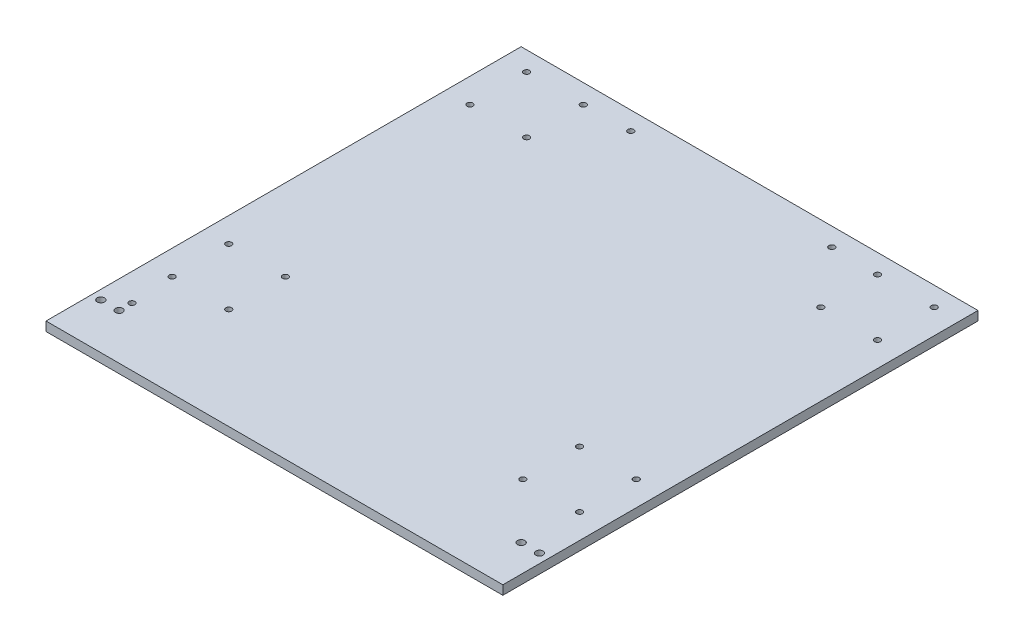
ISO-10303-21;
HEADER;
FILE_DESCRIPTION(('STEP AP214'),'2;1');
FILE_NAME('part.step','',(''),(''),'','','');
FILE_SCHEMA(('AUTOMOTIVE_DESIGN { 1 0 10303 214 1 1 1 1 }'));
ENDSEC;
DATA;
#1=APPLICATION_CONTEXT('core data for automotive mechanical design processes');
#2=APPLICATION_PROTOCOL_DEFINITION('international standard','automotive_design',2000,#1);
#3=PRODUCT_CONTEXT('',#1,'mechanical');
#4=PRODUCT('Part','Part','',(#3));
#5=PRODUCT_RELATED_PRODUCT_CATEGORY('part','',(#4));
#6=PRODUCT_DEFINITION_FORMATION('','',#4);
#7=PRODUCT_DEFINITION_CONTEXT('part definition',#1,'design');
#8=PRODUCT_DEFINITION('design','',#6,#7);
#9=PRODUCT_DEFINITION_SHAPE('','',#8);
#10=(LENGTH_UNIT() NAMED_UNIT(*) SI_UNIT(.MILLI.,.METRE.));
#11=(NAMED_UNIT(*) PLANE_ANGLE_UNIT() SI_UNIT($,.RADIAN.));
#12=(NAMED_UNIT(*) SI_UNIT($,.STERADIAN.) SOLID_ANGLE_UNIT());
#13=UNCERTAINTY_MEASURE_WITH_UNIT(LENGTH_MEASURE(1.E-05),#10,'distance_accuracy_value','');
#14=(GEOMETRIC_REPRESENTATION_CONTEXT(3) GLOBAL_UNCERTAINTY_ASSIGNED_CONTEXT((#13)) GLOBAL_UNIT_ASSIGNED_CONTEXT((#10,
#11,#12)) REPRESENTATION_CONTEXT('',''));
#15=CARTESIAN_POINT('',(0.,0.,0.));
#16=DIRECTION('',(0.,0.,1.));
#17=DIRECTION('',(1.,0.,0.));
#18=AXIS2_PLACEMENT_3D('',#15,#16,#17);
#19=CARTESIAN_POINT('',(0.,5.,0.));
#20=DIRECTION('',(0.,-1.,0.));
#21=DIRECTION('',(0.,0.,-1.));
#22=AXIS2_PLACEMENT_3D('',#19,#20,#21);
#23=PLANE('',#22);
#24=DIRECTION('',(0.,0.,-1.));
#25=VECTOR('',#24,1.);
#26=CARTESIAN_POINT('',(125.,5.,130.));
#27=LINE('',#26,#25);
#28=CARTESIAN_POINT('',(125.,5.,130.));
#29=VERTEX_POINT('',#28);
#30=CARTESIAN_POINT('',(125.,5.,-130.));
#31=VERTEX_POINT('',#30);
#32=EDGE_CURVE('E85',#29,#31,#27,.T.);
#33=ORIENTED_EDGE('',*,*,#32,.T.);
#34=DIRECTION('',(-1.,0.,0.));
#35=VECTOR('',#34,1.);
#36=CARTESIAN_POINT('',(-125.,5.,-130.));
#37=LINE('',#36,#35);
#38=CARTESIAN_POINT('',(-125.,5.,-130.));
#39=VERTEX_POINT('',#38);
#40=EDGE_CURVE('E80',#31,#39,#37,.T.);
#41=ORIENTED_EDGE('',*,*,#40,.T.);
#42=DIRECTION('',(0.,0.,1.));
#43=VECTOR('',#42,1.);
#44=CARTESIAN_POINT('',(-125.,5.,130.));
#45=LINE('',#44,#43);
#46=CARTESIAN_POINT('',(-125.,5.,130.));
#47=VERTEX_POINT('',#46);
#48=EDGE_CURVE('E83',#39,#47,#45,.T.);
#49=ORIENTED_EDGE('',*,*,#48,.T.);
#50=DIRECTION('',(1.,0.,0.));
#51=VECTOR('',#50,1.);
#52=CARTESIAN_POINT('',(-125.,5.,130.));
#53=LINE('',#52,#51);
#54=EDGE_CURVE('E50',#47,#29,#53,.T.);
#55=ORIENTED_EDGE('',*,*,#54,.T.);
#56=EDGE_LOOP('',(#33,#41,#49,#55));
#57=FACE_BOUND('',#56,.T.);
#58=CARTESIAN_POINT('',(-111.5,5.,43.5));
#59=DIRECTION('',(0.,1.,0.));
#60=DIRECTION('',(0.,0.,1.));
#61=AXIS2_PLACEMENT_3D('',#58,#59,#60);
#62=CIRCLE('',#61,1.60000000000001);
#63=CARTESIAN_POINT('',(-111.5,5.,45.1));
#64=VERTEX_POINT('',#63);
#65=EDGE_CURVE('E100',#64,#64,#62,.T.);
#66=ORIENTED_EDGE('',*,*,#65,.F.);
#67=EDGE_LOOP('',(#66));
#68=FACE_BOUND('',#67,.T.);
#69=CARTESIAN_POINT('',(-111.5,5.,-119.5));
#70=DIRECTION('',(0.,1.,0.));
#71=DIRECTION('',(0.,0.,1.));
#72=AXIS2_PLACEMENT_3D('',#69,#70,#71);
#73=CIRCLE('',#72,1.60000000000001);
#74=CARTESIAN_POINT('',(-111.5,5.,-117.9));
#75=VERTEX_POINT('',#74);
#76=EDGE_CURVE('E115',#75,#75,#73,.T.);
#77=ORIENTED_EDGE('',*,*,#76,.F.);
#78=EDGE_LOOP('',(#77));
#79=FACE_BOUND('',#78,.T.);
#80=CARTESIAN_POINT('',(-80.5,5.,-119.5));
#81=DIRECTION('',(0.,1.,0.));
#82=DIRECTION('',(0.,0.,1.));
#83=AXIS2_PLACEMENT_3D('',#80,#81,#82);
#84=CIRCLE('',#83,1.60000000000001);
#85=CARTESIAN_POINT('',(-80.5,5.,-117.9));
#86=VERTEX_POINT('',#85);
#87=EDGE_CURVE('E121',#86,#86,#84,.T.);
#88=ORIENTED_EDGE('',*,*,#87,.F.);
#89=EDGE_LOOP('',(#88));
#90=FACE_BOUND('',#89,.T.);
#91=CARTESIAN_POINT('',(-80.5,5.,-88.5));
#92=DIRECTION('',(0.,1.,0.));
#93=DIRECTION('',(0.,0.,1.));
#94=AXIS2_PLACEMENT_3D('',#91,#92,#93);
#95=CIRCLE('',#94,1.60000000000001);
#96=CARTESIAN_POINT('',(-80.5,5.,-86.9));
#97=VERTEX_POINT('',#96);
#98=EDGE_CURVE('E127',#97,#97,#95,.T.);
#99=ORIENTED_EDGE('',*,*,#98,.F.);
#100=EDGE_LOOP('',(#99));
#101=FACE_BOUND('',#100,.T.);
#102=CARTESIAN_POINT('',(-111.5,5.,-88.5));
#103=DIRECTION('',(0.,1.,0.));
#104=DIRECTION('',(0.,0.,1.));
#105=AXIS2_PLACEMENT_3D('',#102,#103,#104);
#106=CIRCLE('',#105,1.60000000000028);
#107=CARTESIAN_POINT('',(-111.5,5.,-86.8999999999997));
#108=VERTEX_POINT('',#107);
#109=EDGE_CURVE('E133',#108,#108,#106,.T.);
#110=ORIENTED_EDGE('',*,*,#109,.F.);
#111=EDGE_LOOP('',(#110));
#112=FACE_BOUND('',#111,.T.);
#113=CARTESIAN_POINT('',(-80.5,5.,43.5));
#114=DIRECTION('',(0.,1.,0.));
#115=DIRECTION('',(0.,0.,1.));
#116=AXIS2_PLACEMENT_3D('',#113,#114,#115);
#117=CIRCLE('',#116,1.60000000000002);
#118=CARTESIAN_POINT('',(-80.5,5.,45.1));
#119=VERTEX_POINT('',#118);
#120=EDGE_CURVE('E139',#119,#119,#117,.T.);
#121=ORIENTED_EDGE('',*,*,#120,.F.);
#122=EDGE_LOOP('',(#121));
#123=FACE_BOUND('',#122,.T.);
#124=CARTESIAN_POINT('',(-80.5,5.,74.5));
#125=DIRECTION('',(0.,1.,0.));
#126=DIRECTION('',(0.,0.,1.));
#127=AXIS2_PLACEMENT_3D('',#124,#125,#126);
#128=CIRCLE('',#127,1.59999999999999);
#129=CARTESIAN_POINT('',(-80.5,5.,76.1));
#130=VERTEX_POINT('',#129);
#131=EDGE_CURVE('E145',#130,#130,#128,.T.);
#132=ORIENTED_EDGE('',*,*,#131,.F.);
#133=EDGE_LOOP('',(#132));
#134=FACE_BOUND('',#133,.T.);
#135=CARTESIAN_POINT('',(-111.5,5.,74.5));
#136=DIRECTION('',(0.,1.,0.));
#137=DIRECTION('',(0.,0.,1.));
#138=AXIS2_PLACEMENT_3D('',#135,#136,#137);
#139=CIRCLE('',#138,1.59999999999999);
#140=CARTESIAN_POINT('',(-111.5,5.,76.1));
#141=VERTEX_POINT('',#140);
#142=EDGE_CURVE('E151',#141,#141,#139,.T.);
#143=ORIENTED_EDGE('',*,*,#142,.F.);
#144=EDGE_LOOP('',(#143));
#145=FACE_BOUND('',#144,.T.);
#146=CARTESIAN_POINT('',(111.5,5.,74.5));
#147=DIRECTION('',(0.,1.,0.));
#148=DIRECTION('',(0.,0.,-1.));
#149=AXIS2_PLACEMENT_3D('',#146,#147,#148);
#150=CIRCLE('',#149,1.59999999999999);
#151=CARTESIAN_POINT('',(111.5,5.,72.9));
#152=VERTEX_POINT('',#151);
#153=EDGE_CURVE('E157',#152,#152,#150,.T.);
#154=ORIENTED_EDGE('',*,*,#153,.F.);
#155=EDGE_LOOP('',(#154));
#156=FACE_BOUND('',#155,.T.);
#157=CARTESIAN_POINT('',(80.5,5.,74.5));
#158=DIRECTION('',(0.,1.,0.));
#159=DIRECTION('',(0.,0.,-1.));
#160=AXIS2_PLACEMENT_3D('',#157,#158,#159);
#161=CIRCLE('',#160,1.59999999999958);
#162=CARTESIAN_POINT('',(80.5,5.,72.9000000000004));
#163=VERTEX_POINT('',#162);
#164=EDGE_CURVE('E163',#163,#163,#161,.T.);
#165=ORIENTED_EDGE('',*,*,#164,.F.);
#166=EDGE_LOOP('',(#165));
#167=FACE_BOUND('',#166,.T.);
#168=CARTESIAN_POINT('',(80.5,5.,43.5));
#169=DIRECTION('',(0.,1.,0.));
#170=DIRECTION('',(0.,0.,-1.));
#171=AXIS2_PLACEMENT_3D('',#168,#169,#170);
#172=CIRCLE('',#171,1.59999999999961);
#173=CARTESIAN_POINT('',(80.5,5.,41.9000000000003));
#174=VERTEX_POINT('',#173);
#175=EDGE_CURVE('E169',#174,#174,#172,.T.);
#176=ORIENTED_EDGE('',*,*,#175,.F.);
#177=EDGE_LOOP('',(#176));
#178=FACE_BOUND('',#177,.T.);
#179=CARTESIAN_POINT('',(111.5,5.,43.5));
#180=DIRECTION('',(0.,1.,0.));
#181=DIRECTION('',(0.,0.,-1.));
#182=AXIS2_PLACEMENT_3D('',#179,#180,#181);
#183=CIRCLE('',#182,1.60000000000002);
#184=CARTESIAN_POINT('',(111.5,5.,41.8999999999999));
#185=VERTEX_POINT('',#184);
#186=EDGE_CURVE('E175',#185,#185,#183,.T.);
#187=ORIENTED_EDGE('',*,*,#186,.F.);
#188=EDGE_LOOP('',(#187));
#189=FACE_BOUND('',#188,.T.);
#190=CARTESIAN_POINT('',(111.5,5.,-88.5));
#191=DIRECTION('',(0.,1.,0.));
#192=DIRECTION('',(0.,0.,-1.));
#193=AXIS2_PLACEMENT_3D('',#190,#191,#192);
#194=CIRCLE('',#193,1.6000000000003);
#195=CARTESIAN_POINT('',(111.5,5.,-90.1000000000003));
#196=VERTEX_POINT('',#195);
#197=EDGE_CURVE('E181',#196,#196,#194,.T.);
#198=ORIENTED_EDGE('',*,*,#197,.F.);
#199=EDGE_LOOP('',(#198));
#200=FACE_BOUND('',#199,.T.);
#201=CARTESIAN_POINT('',(80.5,5.,-88.5));
#202=DIRECTION('',(0.,1.,0.));
#203=DIRECTION('',(0.,0.,-1.));
#204=AXIS2_PLACEMENT_3D('',#201,#202,#203);
#205=CIRCLE('',#204,1.60000000000038);
#206=CARTESIAN_POINT('',(80.5,5.,-90.1000000000004));
#207=VERTEX_POINT('',#206);
#208=EDGE_CURVE('E187',#207,#207,#205,.T.);
#209=ORIENTED_EDGE('',*,*,#208,.F.);
#210=EDGE_LOOP('',(#209));
#211=FACE_BOUND('',#210,.T.);
#212=CARTESIAN_POINT('',(80.5,5.,-119.5));
#213=DIRECTION('',(0.,1.,0.));
#214=DIRECTION('',(0.,0.,-1.));
#215=AXIS2_PLACEMENT_3D('',#212,#213,#214);
#216=CIRCLE('',#215,1.60000000000001);
#217=CARTESIAN_POINT('',(80.5,5.,-121.1));
#218=VERTEX_POINT('',#217);
#219=EDGE_CURVE('E193',#218,#218,#216,.T.);
#220=ORIENTED_EDGE('',*,*,#219,.F.);
#221=EDGE_LOOP('',(#220));
#222=FACE_BOUND('',#221,.T.);
#223=CARTESIAN_POINT('',(111.5,5.,-119.5));
#224=DIRECTION('',(0.,1.,0.));
#225=DIRECTION('',(0.,0.,-1.));
#226=AXIS2_PLACEMENT_3D('',#223,#224,#225);
#227=CIRCLE('',#226,1.60000000000001);
#228=CARTESIAN_POINT('',(111.5,5.,-121.1));
#229=VERTEX_POINT('',#228);
#230=EDGE_CURVE('E199',#229,#229,#227,.T.);
#231=ORIENTED_EDGE('',*,*,#230,.F.);
#232=EDGE_LOOP('',(#231));
#233=FACE_BOUND('',#232,.T.);
#234=CARTESIAN_POINT('',(-110.,5.,105.));
#235=DIRECTION('',(0.,1.,0.));
#236=DIRECTION('',(0.,0.,1.));
#237=AXIS2_PLACEMENT_3D('',#234,#235,#236);
#238=CIRCLE('',#237,2.);
#239=CARTESIAN_POINT('',(-110.,5.,107.));
#240=VERTEX_POINT('',#239);
#241=EDGE_CURVE('E205',#240,#240,#238,.T.);
#242=ORIENTED_EDGE('',*,*,#241,.F.);
#243=EDGE_LOOP('',(#242));
#244=FACE_BOUND('',#243,.T.);
#245=CARTESIAN_POINT('',(110.,5.,105.));
#246=DIRECTION('',(0.,1.,0.));
#247=DIRECTION('',(0.,0.,-1.));
#248=AXIS2_PLACEMENT_3D('',#245,#246,#247);
#249=CIRCLE('',#248,2.);
#250=CARTESIAN_POINT('',(110.,5.,103.));
#251=VERTEX_POINT('',#250);
#252=EDGE_CURVE('E211',#251,#251,#249,.T.);
#253=ORIENTED_EDGE('',*,*,#252,.F.);
#254=EDGE_LOOP('',(#253));
#255=FACE_BOUND('',#254,.T.);
#256=CARTESIAN_POINT('',(120.,5.,105.));
#257=DIRECTION('',(0.,1.,0.));
#258=DIRECTION('',(0.,0.,-1.));
#259=AXIS2_PLACEMENT_3D('',#256,#257,#258);
#260=CIRCLE('',#259,2.);
#261=CARTESIAN_POINT('',(120.,5.,103.));
#262=VERTEX_POINT('',#261);
#263=EDGE_CURVE('E217',#262,#262,#260,.T.);
#264=ORIENTED_EDGE('',*,*,#263,.F.);
#265=EDGE_LOOP('',(#264));
#266=FACE_BOUND('',#265,.T.);
#267=CARTESIAN_POINT('',(-120.,5.,105.));
#268=DIRECTION('',(0.,1.,0.));
#269=DIRECTION('',(0.,0.,1.));
#270=AXIS2_PLACEMENT_3D('',#267,#268,#269);
#271=CIRCLE('',#270,2.);
#272=CARTESIAN_POINT('',(-120.,5.,107.));
#273=VERTEX_POINT('',#272);
#274=EDGE_CURVE('E223',#273,#273,#271,.T.);
#275=ORIENTED_EDGE('',*,*,#274,.F.);
#276=EDGE_LOOP('',(#275));
#277=FACE_BOUND('',#276,.T.);
#278=CARTESIAN_POINT('',(-55.,5.,-120.));
#279=DIRECTION('',(0.,1.,0.));
#280=DIRECTION('',(0.,0.,1.));
#281=AXIS2_PLACEMENT_3D('',#278,#279,#280);
#282=CIRCLE('',#281,1.6);
#283=CARTESIAN_POINT('',(-55.,5.,-118.4));
#284=VERTEX_POINT('',#283);
#285=EDGE_CURVE('E229',#284,#284,#282,.T.);
#286=ORIENTED_EDGE('',*,*,#285,.F.);
#287=EDGE_LOOP('',(#286));
#288=FACE_BOUND('',#287,.T.);
#289=CARTESIAN_POINT('',(55.,5.,-120.));
#290=DIRECTION('',(0.,1.,0.));
#291=DIRECTION('',(0.,0.,-1.));
#292=AXIS2_PLACEMENT_3D('',#289,#290,#291);
#293=CIRCLE('',#292,1.6);
#294=CARTESIAN_POINT('',(55.,5.,-121.6));
#295=VERTEX_POINT('',#294);
#296=EDGE_CURVE('E235',#295,#295,#293,.T.);
#297=ORIENTED_EDGE('',*,*,#296,.F.);
#298=EDGE_LOOP('',(#297));
#299=FACE_BOUND('',#298,.T.);
#300=CARTESIAN_POINT('',(-110.,5.,98.));
#301=DIRECTION('',(0.,1.,0.));
#302=DIRECTION('',(0.,0.,1.));
#303=AXIS2_PLACEMENT_3D('',#300,#301,#302);
#304=CIRCLE('',#303,1.60000000000001);
#305=CARTESIAN_POINT('',(-110.,5.,99.6));
#306=VERTEX_POINT('',#305);
#307=EDGE_CURVE('E241',#306,#306,#304,.T.);
#308=ORIENTED_EDGE('',*,*,#307,.F.);
#309=EDGE_LOOP('',(#308));
#310=FACE_BOUND('',#309,.T.);
#311=ADVANCED_FACE('F33',(#57,#68,#79,#90,#101,#112,#123,#134,#145,#156,#167,#178,#189,#200,
#211,#222,#233,#244,#255,#266,#277,#288,#299,#310),#23,.F.);
#312=CARTESIAN_POINT('',(0.,0.,0.));
#313=DIRECTION('',(0.,-1.,0.));
#314=DIRECTION('',(0.,0.,-1.));
#315=AXIS2_PLACEMENT_3D('',#312,#313,#314);
#316=PLANE('',#315);
#317=CARTESIAN_POINT('',(55.,0.,-120.));
#318=DIRECTION('',(0.,1.,0.));
#319=DIRECTION('',(0.,0.,-1.));
#320=AXIS2_PLACEMENT_3D('',#317,#318,#319);
#321=CIRCLE('',#320,1.6);
#322=CARTESIAN_POINT('',(55.,0.,-121.6));
#323=VERTEX_POINT('',#322);
#324=EDGE_CURVE('E238',#323,#323,#321,.T.);
#325=ORIENTED_EDGE('',*,*,#324,.T.);
#326=EDGE_LOOP('',(#325));
#327=FACE_BOUND('',#326,.T.);
#328=CARTESIAN_POINT('',(-120.,0.,105.));
#329=DIRECTION('',(0.,1.,0.));
#330=DIRECTION('',(0.,0.,1.));
#331=AXIS2_PLACEMENT_3D('',#328,#329,#330);
#332=CIRCLE('',#331,2.);
#333=CARTESIAN_POINT('',(-120.,0.,107.));
#334=VERTEX_POINT('',#333);
#335=EDGE_CURVE('E226',#334,#334,#332,.T.);
#336=ORIENTED_EDGE('',*,*,#335,.T.);
#337=EDGE_LOOP('',(#336));
#338=FACE_BOUND('',#337,.T.);
#339=CARTESIAN_POINT('',(110.,0.,105.));
#340=DIRECTION('',(0.,1.,0.));
#341=DIRECTION('',(0.,0.,-1.));
#342=AXIS2_PLACEMENT_3D('',#339,#340,#341);
#343=CIRCLE('',#342,2.);
#344=CARTESIAN_POINT('',(110.,0.,103.));
#345=VERTEX_POINT('',#344);
#346=EDGE_CURVE('E214',#345,#345,#343,.T.);
#347=ORIENTED_EDGE('',*,*,#346,.T.);
#348=EDGE_LOOP('',(#347));
#349=FACE_BOUND('',#348,.T.);
#350=CARTESIAN_POINT('',(111.5,0.,-119.5));
#351=DIRECTION('',(0.,1.,0.));
#352=DIRECTION('',(0.,0.,-1.));
#353=AXIS2_PLACEMENT_3D('',#350,#351,#352);
#354=CIRCLE('',#353,1.60000000000001);
#355=CARTESIAN_POINT('',(111.5,0.,-121.1));
#356=VERTEX_POINT('',#355);
#357=EDGE_CURVE('E202',#356,#356,#354,.T.);
#358=ORIENTED_EDGE('',*,*,#357,.T.);
#359=EDGE_LOOP('',(#358));
#360=FACE_BOUND('',#359,.T.);
#361=CARTESIAN_POINT('',(80.5,0.,-88.5));
#362=DIRECTION('',(0.,1.,0.));
#363=DIRECTION('',(0.,0.,-1.));
#364=AXIS2_PLACEMENT_3D('',#361,#362,#363);
#365=CIRCLE('',#364,1.60000000000038);
#366=CARTESIAN_POINT('',(80.5,0.,-90.1000000000004));
#367=VERTEX_POINT('',#366);
#368=EDGE_CURVE('E190',#367,#367,#365,.T.);
#369=ORIENTED_EDGE('',*,*,#368,.T.);
#370=EDGE_LOOP('',(#369));
#371=FACE_BOUND('',#370,.T.);
#372=CARTESIAN_POINT('',(111.5,0.,43.5));
#373=DIRECTION('',(0.,1.,0.));
#374=DIRECTION('',(0.,0.,-1.));
#375=AXIS2_PLACEMENT_3D('',#372,#373,#374);
#376=CIRCLE('',#375,1.60000000000002);
#377=CARTESIAN_POINT('',(111.5,0.,41.8999999999999));
#378=VERTEX_POINT('',#377);
#379=EDGE_CURVE('E178',#378,#378,#376,.T.);
#380=ORIENTED_EDGE('',*,*,#379,.T.);
#381=EDGE_LOOP('',(#380));
#382=FACE_BOUND('',#381,.T.);
#383=CARTESIAN_POINT('',(80.5,0.,74.5));
#384=DIRECTION('',(0.,1.,0.));
#385=DIRECTION('',(0.,0.,-1.));
#386=AXIS2_PLACEMENT_3D('',#383,#384,#385);
#387=CIRCLE('',#386,1.59999999999958);
#388=CARTESIAN_POINT('',(80.5,0.,72.9000000000004));
#389=VERTEX_POINT('',#388);
#390=EDGE_CURVE('E166',#389,#389,#387,.T.);
#391=ORIENTED_EDGE('',*,*,#390,.T.);
#392=EDGE_LOOP('',(#391));
#393=FACE_BOUND('',#392,.T.);
#394=CARTESIAN_POINT('',(-111.5,0.,74.5));
#395=DIRECTION('',(0.,1.,0.));
#396=DIRECTION('',(0.,0.,1.));
#397=AXIS2_PLACEMENT_3D('',#394,#395,#396);
#398=CIRCLE('',#397,1.59999999999999);
#399=CARTESIAN_POINT('',(-111.5,0.,76.1));
#400=VERTEX_POINT('',#399);
#401=EDGE_CURVE('E154',#400,#400,#398,.T.);
#402=ORIENTED_EDGE('',*,*,#401,.T.);
#403=EDGE_LOOP('',(#402));
#404=FACE_BOUND('',#403,.T.);
#405=CARTESIAN_POINT('',(-80.5,0.,43.5));
#406=DIRECTION('',(0.,1.,0.));
#407=DIRECTION('',(0.,0.,1.));
#408=AXIS2_PLACEMENT_3D('',#405,#406,#407);
#409=CIRCLE('',#408,1.60000000000002);
#410=CARTESIAN_POINT('',(-80.5,0.,45.1));
#411=VERTEX_POINT('',#410);
#412=EDGE_CURVE('E142',#411,#411,#409,.T.);
#413=ORIENTED_EDGE('',*,*,#412,.T.);
#414=EDGE_LOOP('',(#413));
#415=FACE_BOUND('',#414,.T.);
#416=CARTESIAN_POINT('',(-80.5,0.,-88.5));
#417=DIRECTION('',(0.,1.,0.));
#418=DIRECTION('',(0.,0.,1.));
#419=AXIS2_PLACEMENT_3D('',#416,#417,#418);
#420=CIRCLE('',#419,1.60000000000001);
#421=CARTESIAN_POINT('',(-80.5,0.,-86.9));
#422=VERTEX_POINT('',#421);
#423=EDGE_CURVE('E130',#422,#422,#420,.T.);
#424=ORIENTED_EDGE('',*,*,#423,.T.);
#425=EDGE_LOOP('',(#424));
#426=FACE_BOUND('',#425,.T.);
#427=CARTESIAN_POINT('',(-111.5,0.,-119.5));
#428=DIRECTION('',(0.,1.,0.));
#429=DIRECTION('',(0.,0.,1.));
#430=AXIS2_PLACEMENT_3D('',#427,#428,#429);
#431=CIRCLE('',#430,1.60000000000001);
#432=CARTESIAN_POINT('',(-111.5,0.,-117.9));
#433=VERTEX_POINT('',#432);
#434=EDGE_CURVE('E118',#433,#433,#431,.T.);
#435=ORIENTED_EDGE('',*,*,#434,.T.);
#436=EDGE_LOOP('',(#435));
#437=FACE_BOUND('',#436,.T.);
#438=DIRECTION('',(0.,0.,-1.));
#439=VECTOR('',#438,1.);
#440=CARTESIAN_POINT('',(125.,0.,130.));
#441=LINE('',#440,#439);
#442=CARTESIAN_POINT('',(125.,0.,130.));
#443=VERTEX_POINT('',#442);
#444=CARTESIAN_POINT('',(125.,0.,-130.));
#445=VERTEX_POINT('',#444);
#446=EDGE_CURVE('E97',#443,#445,#441,.T.);
#447=ORIENTED_EDGE('',*,*,#446,.F.);
#448=DIRECTION('',(1.,0.,0.));
#449=VECTOR('',#448,1.);
#450=CARTESIAN_POINT('',(-125.,0.,130.));
#451=LINE('',#450,#449);
#452=CARTESIAN_POINT('',(-125.,0.,130.));
#453=VERTEX_POINT('',#452);
#454=EDGE_CURVE('E73',#453,#443,#451,.T.);
#455=ORIENTED_EDGE('',*,*,#454,.F.);
#456=DIRECTION('',(0.,0.,1.));
#457=VECTOR('',#456,1.);
#458=CARTESIAN_POINT('',(-125.,0.,130.));
#459=LINE('',#458,#457);
#460=CARTESIAN_POINT('',(-125.,0.,-130.));
#461=VERTEX_POINT('',#460);
#462=EDGE_CURVE('E67',#461,#453,#459,.T.);
#463=ORIENTED_EDGE('',*,*,#462,.F.);
#464=DIRECTION('',(-1.,0.,0.));
#465=VECTOR('',#464,1.);
#466=CARTESIAN_POINT('',(-125.,0.,-130.));
#467=LINE('',#466,#465);
#468=EDGE_CURVE('E89',#445,#461,#467,.T.);
#469=ORIENTED_EDGE('',*,*,#468,.F.);
#470=EDGE_LOOP('',(#447,#455,#463,#469));
#471=FACE_BOUND('',#470,.T.);
#472=CARTESIAN_POINT('',(-111.5,0.,43.5));
#473=DIRECTION('',(0.,1.,0.));
#474=DIRECTION('',(0.,0.,1.));
#475=AXIS2_PLACEMENT_3D('',#472,#473,#474);
#476=CIRCLE('',#475,1.60000000000001);
#477=CARTESIAN_POINT('',(-111.5,0.,45.1));
#478=VERTEX_POINT('',#477);
#479=EDGE_CURVE('E112',#478,#478,#476,.T.);
#480=ORIENTED_EDGE('',*,*,#479,.T.);
#481=EDGE_LOOP('',(#480));
#482=FACE_BOUND('',#481,.T.);
#483=CARTESIAN_POINT('',(-80.5,0.,-119.5));
#484=DIRECTION('',(0.,1.,0.));
#485=DIRECTION('',(0.,0.,1.));
#486=AXIS2_PLACEMENT_3D('',#483,#484,#485);
#487=CIRCLE('',#486,1.60000000000001);
#488=CARTESIAN_POINT('',(-80.5,0.,-117.9));
#489=VERTEX_POINT('',#488);
#490=EDGE_CURVE('E124',#489,#489,#487,.T.);
#491=ORIENTED_EDGE('',*,*,#490,.T.);
#492=EDGE_LOOP('',(#491));
#493=FACE_BOUND('',#492,.T.);
#494=CARTESIAN_POINT('',(-111.5,0.,-88.5));
#495=DIRECTION('',(0.,1.,0.));
#496=DIRECTION('',(0.,0.,1.));
#497=AXIS2_PLACEMENT_3D('',#494,#495,#496);
#498=CIRCLE('',#497,1.60000000000028);
#499=CARTESIAN_POINT('',(-111.5,0.,-86.8999999999997));
#500=VERTEX_POINT('',#499);
#501=EDGE_CURVE('E136',#500,#500,#498,.T.);
#502=ORIENTED_EDGE('',*,*,#501,.T.);
#503=EDGE_LOOP('',(#502));
#504=FACE_BOUND('',#503,.T.);
#505=CARTESIAN_POINT('',(-80.5,0.,74.5));
#506=DIRECTION('',(0.,1.,0.));
#507=DIRECTION('',(0.,0.,1.));
#508=AXIS2_PLACEMENT_3D('',#505,#506,#507);
#509=CIRCLE('',#508,1.59999999999999);
#510=CARTESIAN_POINT('',(-80.5,0.,76.1));
#511=VERTEX_POINT('',#510);
#512=EDGE_CURVE('E148',#511,#511,#509,.T.);
#513=ORIENTED_EDGE('',*,*,#512,.T.);
#514=EDGE_LOOP('',(#513));
#515=FACE_BOUND('',#514,.T.);
#516=CARTESIAN_POINT('',(111.5,0.,74.5));
#517=DIRECTION('',(0.,1.,0.));
#518=DIRECTION('',(0.,0.,-1.));
#519=AXIS2_PLACEMENT_3D('',#516,#517,#518);
#520=CIRCLE('',#519,1.59999999999999);
#521=CARTESIAN_POINT('',(111.5,0.,72.9));
#522=VERTEX_POINT('',#521);
#523=EDGE_CURVE('E160',#522,#522,#520,.T.);
#524=ORIENTED_EDGE('',*,*,#523,.T.);
#525=EDGE_LOOP('',(#524));
#526=FACE_BOUND('',#525,.T.);
#527=CARTESIAN_POINT('',(80.5,0.,43.5));
#528=DIRECTION('',(0.,1.,0.));
#529=DIRECTION('',(0.,0.,-1.));
#530=AXIS2_PLACEMENT_3D('',#527,#528,#529);
#531=CIRCLE('',#530,1.59999999999961);
#532=CARTESIAN_POINT('',(80.5,0.,41.9000000000003));
#533=VERTEX_POINT('',#532);
#534=EDGE_CURVE('E172',#533,#533,#531,.T.);
#535=ORIENTED_EDGE('',*,*,#534,.T.);
#536=EDGE_LOOP('',(#535));
#537=FACE_BOUND('',#536,.T.);
#538=CARTESIAN_POINT('',(111.5,0.,-88.5));
#539=DIRECTION('',(0.,1.,0.));
#540=DIRECTION('',(0.,0.,-1.));
#541=AXIS2_PLACEMENT_3D('',#538,#539,#540);
#542=CIRCLE('',#541,1.6000000000003);
#543=CARTESIAN_POINT('',(111.5,0.,-90.1000000000003));
#544=VERTEX_POINT('',#543);
#545=EDGE_CURVE('E184',#544,#544,#542,.T.);
#546=ORIENTED_EDGE('',*,*,#545,.T.);
#547=EDGE_LOOP('',(#546));
#548=FACE_BOUND('',#547,.T.);
#549=CARTESIAN_POINT('',(80.5,0.,-119.5));
#550=DIRECTION('',(0.,1.,0.));
#551=DIRECTION('',(0.,0.,-1.));
#552=AXIS2_PLACEMENT_3D('',#549,#550,#551);
#553=CIRCLE('',#552,1.60000000000001);
#554=CARTESIAN_POINT('',(80.5,0.,-121.1));
#555=VERTEX_POINT('',#554);
#556=EDGE_CURVE('E196',#555,#555,#553,.T.);
#557=ORIENTED_EDGE('',*,*,#556,.T.);
#558=EDGE_LOOP('',(#557));
#559=FACE_BOUND('',#558,.T.);
#560=CARTESIAN_POINT('',(-110.,0.,105.));
#561=DIRECTION('',(0.,1.,0.));
#562=DIRECTION('',(0.,0.,1.));
#563=AXIS2_PLACEMENT_3D('',#560,#561,#562);
#564=CIRCLE('',#563,2.);
#565=CARTESIAN_POINT('',(-110.,0.,107.));
#566=VERTEX_POINT('',#565);
#567=EDGE_CURVE('E208',#566,#566,#564,.T.);
#568=ORIENTED_EDGE('',*,*,#567,.T.);
#569=EDGE_LOOP('',(#568));
#570=FACE_BOUND('',#569,.T.);
#571=CARTESIAN_POINT('',(120.,0.,105.));
#572=DIRECTION('',(0.,1.,0.));
#573=DIRECTION('',(0.,0.,-1.));
#574=AXIS2_PLACEMENT_3D('',#571,#572,#573);
#575=CIRCLE('',#574,2.);
#576=CARTESIAN_POINT('',(120.,0.,103.));
#577=VERTEX_POINT('',#576);
#578=EDGE_CURVE('E220',#577,#577,#575,.T.);
#579=ORIENTED_EDGE('',*,*,#578,.T.);
#580=EDGE_LOOP('',(#579));
#581=FACE_BOUND('',#580,.T.);
#582=CARTESIAN_POINT('',(-55.,0.,-120.));
#583=DIRECTION('',(0.,1.,0.));
#584=DIRECTION('',(0.,0.,1.));
#585=AXIS2_PLACEMENT_3D('',#582,#583,#584);
#586=CIRCLE('',#585,1.6);
#587=CARTESIAN_POINT('',(-55.,0.,-118.4));
#588=VERTEX_POINT('',#587);
#589=EDGE_CURVE('E232',#588,#588,#586,.T.);
#590=ORIENTED_EDGE('',*,*,#589,.T.);
#591=EDGE_LOOP('',(#590));
#592=FACE_BOUND('',#591,.T.);
#593=CARTESIAN_POINT('',(-110.,0.,98.));
#594=DIRECTION('',(0.,1.,0.));
#595=DIRECTION('',(0.,0.,1.));
#596=AXIS2_PLACEMENT_3D('',#593,#594,#595);
#597=CIRCLE('',#596,1.60000000000001);
#598=CARTESIAN_POINT('',(-110.,0.,99.6));
#599=VERTEX_POINT('',#598);
#600=EDGE_CURVE('E244',#599,#599,#597,.T.);
#601=ORIENTED_EDGE('',*,*,#600,.T.);
#602=EDGE_LOOP('',(#601));
#603=FACE_BOUND('',#602,.T.);
#604=ADVANCED_FACE('F108',(#327,#338,#349,#360,#371,#382,#393,#404,#415,#426,#437,#471,#482,
#493,#504,#515,#526,#537,#548,#559,#570,#581,#592,#603),#316,.T.);
#605=CARTESIAN_POINT('',(125.,5.,130.));
#606=DIRECTION('',(-1.,0.,0.));
#607=DIRECTION('',(0.,0.,1.));
#608=AXIS2_PLACEMENT_3D('',#605,#606,#607);
#609=PLANE('',#608);
#610=ORIENTED_EDGE('',*,*,#446,.T.);
#611=DIRECTION('',(0.,-1.,0.));
#612=VECTOR('',#611,1.);
#613=CARTESIAN_POINT('',(125.,5.,-130.));
#614=LINE('',#613,#612);
#615=EDGE_CURVE('E11',#31,#445,#614,.T.);
#616=ORIENTED_EDGE('',*,*,#615,.F.);
#617=ORIENTED_EDGE('',*,*,#32,.F.);
#618=DIRECTION('',(0.,-1.,0.));
#619=VECTOR('',#618,1.);
#620=CARTESIAN_POINT('',(125.,5.,130.));
#621=LINE('',#620,#619);
#622=EDGE_CURVE('E93',#29,#443,#621,.T.);
#623=ORIENTED_EDGE('',*,*,#622,.T.);
#624=EDGE_LOOP('',(#610,#616,#617,#623));
#625=FACE_BOUND('',#624,.T.);
#626=ADVANCED_FACE('F35',(#625),#609,.F.);
#627=CARTESIAN_POINT('',(-125.,5.,-130.));
#628=DIRECTION('',(0.,0.,1.));
#629=DIRECTION('',(1.,0.,0.));
#630=AXIS2_PLACEMENT_3D('',#627,#628,#629);
#631=PLANE('',#630);
#632=ORIENTED_EDGE('',*,*,#468,.T.);
#633=DIRECTION('',(0.,-1.,0.));
#634=VECTOR('',#633,1.);
#635=CARTESIAN_POINT('',(-125.,5.,-130.));
#636=LINE('',#635,#634);
#637=EDGE_CURVE('E42',#39,#461,#636,.T.);
#638=ORIENTED_EDGE('',*,*,#637,.F.);
#639=ORIENTED_EDGE('',*,*,#40,.F.);
#640=ORIENTED_EDGE('',*,*,#615,.T.);
#641=EDGE_LOOP('',(#632,#638,#639,#640));
#642=FACE_BOUND('',#641,.T.);
#643=ADVANCED_FACE('F88',(#642),#631,.F.);
#644=CARTESIAN_POINT('',(-125.,5.,130.));
#645=DIRECTION('',(1.,0.,0.));
#646=DIRECTION('',(0.,0.,-1.));
#647=AXIS2_PLACEMENT_3D('',#644,#645,#646);
#648=PLANE('',#647);
#649=ORIENTED_EDGE('',*,*,#462,.T.);
#650=DIRECTION('',(0.,-1.,0.));
#651=VECTOR('',#650,1.);
#652=CARTESIAN_POINT('',(-125.,5.,130.));
#653=LINE('',#652,#651);
#654=EDGE_CURVE('E90',#47,#453,#653,.T.);
#655=ORIENTED_EDGE('',*,*,#654,.F.);
#656=ORIENTED_EDGE('',*,*,#48,.F.);
#657=ORIENTED_EDGE('',*,*,#637,.T.);
#658=EDGE_LOOP('',(#649,#655,#656,#657));
#659=FACE_BOUND('',#658,.T.);
#660=ADVANCED_FACE('F91',(#659),#648,.F.);
#661=CARTESIAN_POINT('',(-125.,5.,130.));
#662=DIRECTION('',(0.,0.,-1.));
#663=DIRECTION('',(-1.,0.,0.));
#664=AXIS2_PLACEMENT_3D('',#661,#662,#663);
#665=PLANE('',#664);
#666=ORIENTED_EDGE('',*,*,#454,.T.);
#667=ORIENTED_EDGE('',*,*,#622,.F.);
#668=ORIENTED_EDGE('',*,*,#54,.F.);
#669=ORIENTED_EDGE('',*,*,#654,.T.);
#670=EDGE_LOOP('',(#666,#667,#668,#669));
#671=FACE_BOUND('',#670,.T.);
#672=ADVANCED_FACE('F105',(#671),#665,.F.);
#673=CARTESIAN_POINT('',(-111.5,5.,43.5));
#674=DIRECTION('',(0.,-1.,0.));
#675=DIRECTION('',(0.,0.,-1.));
#676=AXIS2_PLACEMENT_3D('',#673,#674,#675);
#677=CYLINDRICAL_SURFACE('',#676,1.60000000000001);
#678=ORIENTED_EDGE('',*,*,#65,.T.);
#679=EDGE_LOOP('',(#678));
#680=FACE_BOUND('',#679,.T.);
#681=ORIENTED_EDGE('',*,*,#479,.F.);
#682=EDGE_LOOP('',(#681));
#683=FACE_BOUND('',#682,.T.);
#684=ADVANCED_FACE('F261',(#680,#683),#677,.F.);
#685=CARTESIAN_POINT('',(-111.5,5.,-119.5));
#686=DIRECTION('',(0.,-1.,0.));
#687=DIRECTION('',(0.,0.,-1.));
#688=AXIS2_PLACEMENT_3D('',#685,#686,#687);
#689=CYLINDRICAL_SURFACE('',#688,1.60000000000001);
#690=ORIENTED_EDGE('',*,*,#76,.T.);
#691=EDGE_LOOP('',(#690));
#692=FACE_BOUND('',#691,.T.);
#693=ORIENTED_EDGE('',*,*,#434,.F.);
#694=EDGE_LOOP('',(#693));
#695=FACE_BOUND('',#694,.T.);
#696=ADVANCED_FACE('F307',(#692,#695),#689,.F.);
#697=CARTESIAN_POINT('',(-80.5,5.,-119.5));
#698=DIRECTION('',(0.,-1.,0.));
#699=DIRECTION('',(0.,0.,-1.));
#700=AXIS2_PLACEMENT_3D('',#697,#698,#699);
#701=CYLINDRICAL_SURFACE('',#700,1.60000000000001);
#702=ORIENTED_EDGE('',*,*,#87,.T.);
#703=EDGE_LOOP('',(#702));
#704=FACE_BOUND('',#703,.T.);
#705=ORIENTED_EDGE('',*,*,#490,.F.);
#706=EDGE_LOOP('',(#705));
#707=FACE_BOUND('',#706,.T.);
#708=ADVANCED_FACE('F315',(#704,#707),#701,.F.);
#709=CARTESIAN_POINT('',(-80.5,5.,-88.5));
#710=DIRECTION('',(0.,-1.,0.));
#711=DIRECTION('',(0.,0.,-1.));
#712=AXIS2_PLACEMENT_3D('',#709,#710,#711);
#713=CYLINDRICAL_SURFACE('',#712,1.60000000000001);
#714=ORIENTED_EDGE('',*,*,#98,.T.);
#715=EDGE_LOOP('',(#714));
#716=FACE_BOUND('',#715,.T.);
#717=ORIENTED_EDGE('',*,*,#423,.F.);
#718=EDGE_LOOP('',(#717));
#719=FACE_BOUND('',#718,.T.);
#720=ADVANCED_FACE('F323',(#716,#719),#713,.F.);
#721=CARTESIAN_POINT('',(-111.5,5.,-88.5));
#722=DIRECTION('',(0.,-1.,0.));
#723=DIRECTION('',(0.,0.,-1.));
#724=AXIS2_PLACEMENT_3D('',#721,#722,#723);
#725=CYLINDRICAL_SURFACE('',#724,1.60000000000028);
#726=ORIENTED_EDGE('',*,*,#109,.T.);
#727=EDGE_LOOP('',(#726));
#728=FACE_BOUND('',#727,.T.);
#729=ORIENTED_EDGE('',*,*,#501,.F.);
#730=EDGE_LOOP('',(#729));
#731=FACE_BOUND('',#730,.T.);
#732=ADVANCED_FACE('F332',(#728,#731),#725,.F.);
#733=CARTESIAN_POINT('',(-80.5,5.,43.5));
#734=DIRECTION('',(0.,-1.,0.));
#735=DIRECTION('',(0.,0.,-1.));
#736=AXIS2_PLACEMENT_3D('',#733,#734,#735);
#737=CYLINDRICAL_SURFACE('',#736,1.60000000000002);
#738=ORIENTED_EDGE('',*,*,#120,.T.);
#739=EDGE_LOOP('',(#738));
#740=FACE_BOUND('',#739,.T.);
#741=ORIENTED_EDGE('',*,*,#412,.F.);
#742=EDGE_LOOP('',(#741));
#743=FACE_BOUND('',#742,.T.);
#744=ADVANCED_FACE('F341',(#740,#743),#737,.F.);
#745=CARTESIAN_POINT('',(-80.5,5.,74.5));
#746=DIRECTION('',(0.,-1.,0.));
#747=DIRECTION('',(0.,0.,-1.));
#748=AXIS2_PLACEMENT_3D('',#745,#746,#747);
#749=CYLINDRICAL_SURFACE('',#748,1.59999999999999);
#750=ORIENTED_EDGE('',*,*,#131,.T.);
#751=EDGE_LOOP('',(#750));
#752=FACE_BOUND('',#751,.T.);
#753=ORIENTED_EDGE('',*,*,#512,.F.);
#754=EDGE_LOOP('',(#753));
#755=FACE_BOUND('',#754,.T.);
#756=ADVANCED_FACE('F350',(#752,#755),#749,.F.);
#757=CARTESIAN_POINT('',(-111.5,5.,74.5));
#758=DIRECTION('',(0.,-1.,0.));
#759=DIRECTION('',(0.,0.,-1.));
#760=AXIS2_PLACEMENT_3D('',#757,#758,#759);
#761=CYLINDRICAL_SURFACE('',#760,1.59999999999999);
#762=ORIENTED_EDGE('',*,*,#142,.T.);
#763=EDGE_LOOP('',(#762));
#764=FACE_BOUND('',#763,.T.);
#765=ORIENTED_EDGE('',*,*,#401,.F.);
#766=EDGE_LOOP('',(#765));
#767=FACE_BOUND('',#766,.T.);
#768=ADVANCED_FACE('F359',(#764,#767),#761,.F.);
#769=CARTESIAN_POINT('',(111.5,5.,74.5));
#770=DIRECTION('',(0.,-1.,0.));
#771=DIRECTION('',(0.,0.,-1.));
#772=AXIS2_PLACEMENT_3D('',#769,#770,#771);
#773=CYLINDRICAL_SURFACE('',#772,1.59999999999999);
#774=ORIENTED_EDGE('',*,*,#153,.T.);
#775=EDGE_LOOP('',(#774));
#776=FACE_BOUND('',#775,.T.);
#777=ORIENTED_EDGE('',*,*,#523,.F.);
#778=EDGE_LOOP('',(#777));
#779=FACE_BOUND('',#778,.T.);
#780=ADVANCED_FACE('F368',(#776,#779),#773,.F.);
#781=CARTESIAN_POINT('',(80.5,5.,74.5));
#782=DIRECTION('',(0.,-1.,0.));
#783=DIRECTION('',(0.,0.,-1.));
#784=AXIS2_PLACEMENT_3D('',#781,#782,#783);
#785=CYLINDRICAL_SURFACE('',#784,1.59999999999958);
#786=ORIENTED_EDGE('',*,*,#164,.T.);
#787=EDGE_LOOP('',(#786));
#788=FACE_BOUND('',#787,.T.);
#789=ORIENTED_EDGE('',*,*,#390,.F.);
#790=EDGE_LOOP('',(#789));
#791=FACE_BOUND('',#790,.T.);
#792=ADVANCED_FACE('F377',(#788,#791),#785,.F.);
#793=CARTESIAN_POINT('',(80.5,5.,43.5));
#794=DIRECTION('',(0.,-1.,0.));
#795=DIRECTION('',(0.,0.,-1.));
#796=AXIS2_PLACEMENT_3D('',#793,#794,#795);
#797=CYLINDRICAL_SURFACE('',#796,1.59999999999961);
#798=ORIENTED_EDGE('',*,*,#175,.T.);
#799=EDGE_LOOP('',(#798));
#800=FACE_BOUND('',#799,.T.);
#801=ORIENTED_EDGE('',*,*,#534,.F.);
#802=EDGE_LOOP('',(#801));
#803=FACE_BOUND('',#802,.T.);
#804=ADVANCED_FACE('F386',(#800,#803),#797,.F.);
#805=CARTESIAN_POINT('',(111.5,5.,43.5));
#806=DIRECTION('',(0.,-1.,0.));
#807=DIRECTION('',(0.,0.,-1.));
#808=AXIS2_PLACEMENT_3D('',#805,#806,#807);
#809=CYLINDRICAL_SURFACE('',#808,1.60000000000002);
#810=ORIENTED_EDGE('',*,*,#186,.T.);
#811=EDGE_LOOP('',(#810));
#812=FACE_BOUND('',#811,.T.);
#813=ORIENTED_EDGE('',*,*,#379,.F.);
#814=EDGE_LOOP('',(#813));
#815=FACE_BOUND('',#814,.T.);
#816=ADVANCED_FACE('F395',(#812,#815),#809,.F.);
#817=CARTESIAN_POINT('',(111.5,5.,-88.5));
#818=DIRECTION('',(0.,-1.,0.));
#819=DIRECTION('',(0.,0.,-1.));
#820=AXIS2_PLACEMENT_3D('',#817,#818,#819);
#821=CYLINDRICAL_SURFACE('',#820,1.6000000000003);
#822=ORIENTED_EDGE('',*,*,#197,.T.);
#823=EDGE_LOOP('',(#822));
#824=FACE_BOUND('',#823,.T.);
#825=ORIENTED_EDGE('',*,*,#545,.F.);
#826=EDGE_LOOP('',(#825));
#827=FACE_BOUND('',#826,.T.);
#828=ADVANCED_FACE('F404',(#824,#827),#821,.F.);
#829=CARTESIAN_POINT('',(80.5,5.,-88.5));
#830=DIRECTION('',(0.,-1.,0.));
#831=DIRECTION('',(0.,0.,-1.));
#832=AXIS2_PLACEMENT_3D('',#829,#830,#831);
#833=CYLINDRICAL_SURFACE('',#832,1.60000000000038);
#834=ORIENTED_EDGE('',*,*,#208,.T.);
#835=EDGE_LOOP('',(#834));
#836=FACE_BOUND('',#835,.T.);
#837=ORIENTED_EDGE('',*,*,#368,.F.);
#838=EDGE_LOOP('',(#837));
#839=FACE_BOUND('',#838,.T.);
#840=ADVANCED_FACE('F413',(#836,#839),#833,.F.);
#841=CARTESIAN_POINT('',(80.5,5.,-119.5));
#842=DIRECTION('',(0.,-1.,0.));
#843=DIRECTION('',(0.,0.,-1.));
#844=AXIS2_PLACEMENT_3D('',#841,#842,#843);
#845=CYLINDRICAL_SURFACE('',#844,1.60000000000001);
#846=ORIENTED_EDGE('',*,*,#219,.T.);
#847=EDGE_LOOP('',(#846));
#848=FACE_BOUND('',#847,.T.);
#849=ORIENTED_EDGE('',*,*,#556,.F.);
#850=EDGE_LOOP('',(#849));
#851=FACE_BOUND('',#850,.T.);
#852=ADVANCED_FACE('F422',(#848,#851),#845,.F.);
#853=CARTESIAN_POINT('',(111.5,5.,-119.5));
#854=DIRECTION('',(0.,-1.,0.));
#855=DIRECTION('',(0.,0.,-1.));
#856=AXIS2_PLACEMENT_3D('',#853,#854,#855);
#857=CYLINDRICAL_SURFACE('',#856,1.60000000000001);
#858=ORIENTED_EDGE('',*,*,#230,.T.);
#859=EDGE_LOOP('',(#858));
#860=FACE_BOUND('',#859,.T.);
#861=ORIENTED_EDGE('',*,*,#357,.F.);
#862=EDGE_LOOP('',(#861));
#863=FACE_BOUND('',#862,.T.);
#864=ADVANCED_FACE('F431',(#860,#863),#857,.F.);
#865=CARTESIAN_POINT('',(-110.,5.,105.));
#866=DIRECTION('',(0.,-1.,0.));
#867=DIRECTION('',(0.,0.,-1.));
#868=AXIS2_PLACEMENT_3D('',#865,#866,#867);
#869=CYLINDRICAL_SURFACE('',#868,2.);
#870=ORIENTED_EDGE('',*,*,#241,.T.);
#871=EDGE_LOOP('',(#870));
#872=FACE_BOUND('',#871,.T.);
#873=ORIENTED_EDGE('',*,*,#567,.F.);
#874=EDGE_LOOP('',(#873));
#875=FACE_BOUND('',#874,.T.);
#876=ADVANCED_FACE('F440',(#872,#875),#869,.F.);
#877=CARTESIAN_POINT('',(110.,5.,105.));
#878=DIRECTION('',(0.,-1.,0.));
#879=DIRECTION('',(0.,0.,-1.));
#880=AXIS2_PLACEMENT_3D('',#877,#878,#879);
#881=CYLINDRICAL_SURFACE('',#880,2.);
#882=ORIENTED_EDGE('',*,*,#252,.T.);
#883=EDGE_LOOP('',(#882));
#884=FACE_BOUND('',#883,.T.);
#885=ORIENTED_EDGE('',*,*,#346,.F.);
#886=EDGE_LOOP('',(#885));
#887=FACE_BOUND('',#886,.T.);
#888=ADVANCED_FACE('F449',(#884,#887),#881,.F.);
#889=CARTESIAN_POINT('',(120.,5.,105.));
#890=DIRECTION('',(0.,-1.,0.));
#891=DIRECTION('',(0.,0.,-1.));
#892=AXIS2_PLACEMENT_3D('',#889,#890,#891);
#893=CYLINDRICAL_SURFACE('',#892,2.);
#894=ORIENTED_EDGE('',*,*,#263,.T.);
#895=EDGE_LOOP('',(#894));
#896=FACE_BOUND('',#895,.T.);
#897=ORIENTED_EDGE('',*,*,#578,.F.);
#898=EDGE_LOOP('',(#897));
#899=FACE_BOUND('',#898,.T.);
#900=ADVANCED_FACE('F458',(#896,#899),#893,.F.);
#901=CARTESIAN_POINT('',(-120.,5.,105.));
#902=DIRECTION('',(0.,-1.,0.));
#903=DIRECTION('',(0.,0.,-1.));
#904=AXIS2_PLACEMENT_3D('',#901,#902,#903);
#905=CYLINDRICAL_SURFACE('',#904,2.);
#906=ORIENTED_EDGE('',*,*,#274,.T.);
#907=EDGE_LOOP('',(#906));
#908=FACE_BOUND('',#907,.T.);
#909=ORIENTED_EDGE('',*,*,#335,.F.);
#910=EDGE_LOOP('',(#909));
#911=FACE_BOUND('',#910,.T.);
#912=ADVANCED_FACE('F467',(#908,#911),#905,.F.);
#913=CARTESIAN_POINT('',(-55.,5.,-120.));
#914=DIRECTION('',(0.,-1.,0.));
#915=DIRECTION('',(0.,0.,-1.));
#916=AXIS2_PLACEMENT_3D('',#913,#914,#915);
#917=CYLINDRICAL_SURFACE('',#916,1.6);
#918=ORIENTED_EDGE('',*,*,#285,.T.);
#919=EDGE_LOOP('',(#918));
#920=FACE_BOUND('',#919,.T.);
#921=ORIENTED_EDGE('',*,*,#589,.F.);
#922=EDGE_LOOP('',(#921));
#923=FACE_BOUND('',#922,.T.);
#924=ADVANCED_FACE('F476',(#920,#923),#917,.F.);
#925=CARTESIAN_POINT('',(55.,5.,-120.));
#926=DIRECTION('',(0.,-1.,0.));
#927=DIRECTION('',(0.,0.,-1.));
#928=AXIS2_PLACEMENT_3D('',#925,#926,#927);
#929=CYLINDRICAL_SURFACE('',#928,1.6);
#930=ORIENTED_EDGE('',*,*,#296,.T.);
#931=EDGE_LOOP('',(#930));
#932=FACE_BOUND('',#931,.T.);
#933=ORIENTED_EDGE('',*,*,#324,.F.);
#934=EDGE_LOOP('',(#933));
#935=FACE_BOUND('',#934,.T.);
#936=ADVANCED_FACE('F485',(#932,#935),#929,.F.);
#937=CARTESIAN_POINT('',(-110.,5.,98.));
#938=DIRECTION('',(0.,-1.,0.));
#939=DIRECTION('',(0.,0.,-1.));
#940=AXIS2_PLACEMENT_3D('',#937,#938,#939);
#941=CYLINDRICAL_SURFACE('',#940,1.60000000000001);
#942=ORIENTED_EDGE('',*,*,#307,.T.);
#943=EDGE_LOOP('',(#942));
#944=FACE_BOUND('',#943,.T.);
#945=ORIENTED_EDGE('',*,*,#600,.F.);
#946=EDGE_LOOP('',(#945));
#947=FACE_BOUND('',#946,.T.);
#948=ADVANCED_FACE('F250',(#944,#947),#941,.F.);
#949=CLOSED_SHELL('',(#311,#604,#626,#643,#660,#672,#684,#696,#708,#720,#732,#744,#756,#768,
#780,#792,#804,#816,#828,#840,#852,#864,#876,#888,#900,#912,#924,#936,#948));
#950=MANIFOLD_SOLID_BREP('B2',#949);
#951=ADVANCED_BREP_SHAPE_REPRESENTATION('',(#18,#950),#14);
#952=SHAPE_DEFINITION_REPRESENTATION(#9,#951);
ENDSEC;
END-ISO-10303-21;
